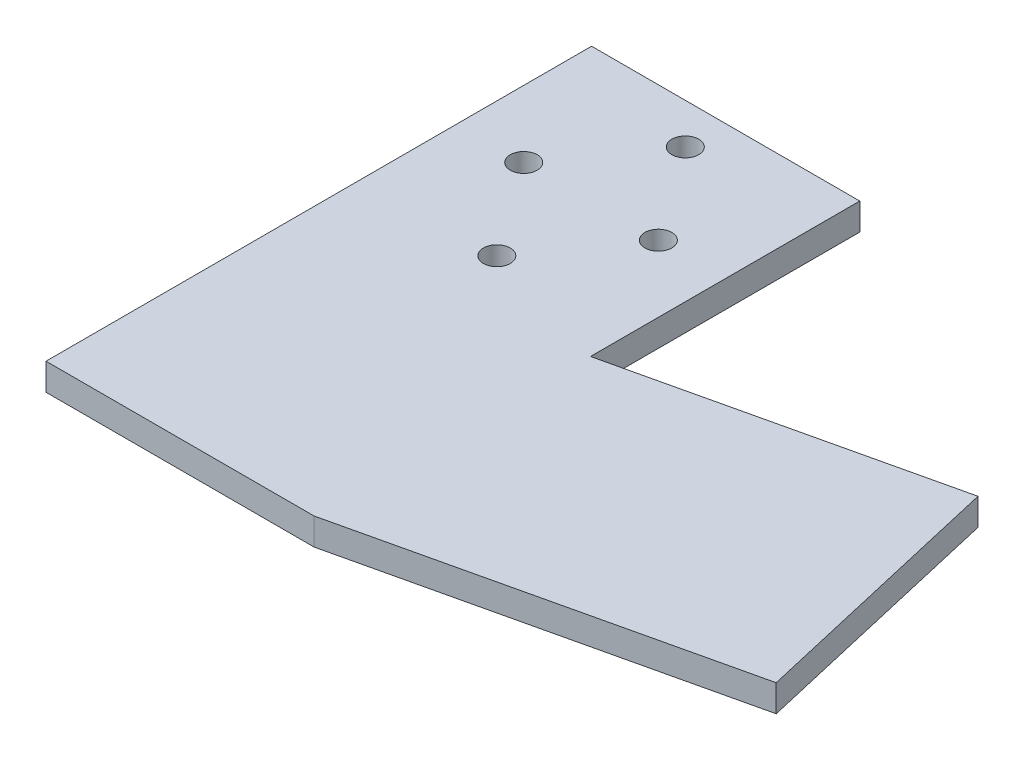
ISO-10303-21;
HEADER;
FILE_DESCRIPTION(('STEP AP214'),'2;1');
FILE_NAME('part.step','',(''),(''),'','','');
FILE_SCHEMA(('AUTOMOTIVE_DESIGN { 1 0 10303 214 1 1 1 1 }'));
ENDSEC;
DATA;
#1=APPLICATION_CONTEXT('core data for automotive mechanical design processes');
#2=APPLICATION_PROTOCOL_DEFINITION('international standard','automotive_design',2000,#1);
#3=PRODUCT_CONTEXT('',#1,'mechanical');
#4=PRODUCT('Part','Part','',(#3));
#5=PRODUCT_RELATED_PRODUCT_CATEGORY('part','',(#4));
#6=PRODUCT_DEFINITION_FORMATION('','',#4);
#7=PRODUCT_DEFINITION_CONTEXT('part definition',#1,'design');
#8=PRODUCT_DEFINITION('design','',#6,#7);
#9=PRODUCT_DEFINITION_SHAPE('','',#8);
#10=(LENGTH_UNIT() NAMED_UNIT(*) SI_UNIT(.MILLI.,.METRE.));
#11=(NAMED_UNIT(*) PLANE_ANGLE_UNIT() SI_UNIT($,.RADIAN.));
#12=(NAMED_UNIT(*) SI_UNIT($,.STERADIAN.) SOLID_ANGLE_UNIT());
#13=UNCERTAINTY_MEASURE_WITH_UNIT(LENGTH_MEASURE(1.E-05),#10,'distance_accuracy_value','');
#14=(GEOMETRIC_REPRESENTATION_CONTEXT(3) GLOBAL_UNCERTAINTY_ASSIGNED_CONTEXT((#13)) GLOBAL_UNIT_ASSIGNED_CONTEXT((#10,
#11,#12)) REPRESENTATION_CONTEXT('',''));
#15=CARTESIAN_POINT('',(0.,0.,0.));
#16=DIRECTION('',(0.,0.,1.));
#17=DIRECTION('',(1.,0.,0.));
#18=AXIS2_PLACEMENT_3D('',#15,#16,#17);
#19=CARTESIAN_POINT('',(0.,5.,0.));
#20=DIRECTION('',(-1.,0.,0.));
#21=DIRECTION('',(0.,0.,1.));
#22=AXIS2_PLACEMENT_3D('',#19,#20,#21);
#23=PLANE('',#22);
#24=DIRECTION('',(0.,0.,-1.));
#25=VECTOR('',#24,1.);
#26=CARTESIAN_POINT('',(0.,0.,0.));
#27=LINE('',#26,#25);
#28=CARTESIAN_POINT('',(0.,0.,0.));
#29=VERTEX_POINT('',#28);
#30=CARTESIAN_POINT('',(0.,0.,-50.));
#31=VERTEX_POINT('',#30);
#32=EDGE_CURVE('E133',#29,#31,#27,.T.);
#33=ORIENTED_EDGE('',*,*,#32,.T.);
#34=DIRECTION('',(0.,-1.,0.));
#35=VECTOR('',#34,1.);
#36=CARTESIAN_POINT('',(0.,5.,-50.));
#37=LINE('',#36,#35);
#38=CARTESIAN_POINT('',(0.,5.,-50.));
#39=VERTEX_POINT('',#38);
#40=EDGE_CURVE('E11',#39,#31,#37,.T.);
#41=ORIENTED_EDGE('',*,*,#40,.F.);
#42=DIRECTION('',(0.,0.,-1.));
#43=VECTOR('',#42,1.);
#44=CARTESIAN_POINT('',(0.,5.,0.));
#45=LINE('',#44,#43);
#46=CARTESIAN_POINT('',(0.,5.,0.));
#47=VERTEX_POINT('',#46);
#48=EDGE_CURVE('E154',#47,#39,#45,.T.);
#49=ORIENTED_EDGE('',*,*,#48,.F.);
#50=DIRECTION('',(0.,-1.,0.));
#51=VECTOR('',#50,1.);
#52=CARTESIAN_POINT('',(0.,5.,0.));
#53=LINE('',#52,#51);
#54=EDGE_CURVE('E129',#47,#29,#53,.T.);
#55=ORIENTED_EDGE('',*,*,#54,.T.);
#56=EDGE_LOOP('',(#33,#41,#49,#55));
#57=FACE_BOUND('',#56,.T.);
#58=ADVANCED_FACE('F38',(#57),#23,.F.);
#59=CARTESIAN_POINT('',(-49.8,5.,-50.));
#60=DIRECTION('',(0.,0.,1.));
#61=DIRECTION('',(1.,0.,0.));
#62=AXIS2_PLACEMENT_3D('',#59,#60,#61);
#63=PLANE('',#62);
#64=DIRECTION('',(-1.,0.,0.));
#65=VECTOR('',#64,1.);
#66=CARTESIAN_POINT('',(-49.8,0.,-50.));
#67=LINE('',#66,#65);
#68=CARTESIAN_POINT('',(-49.8,0.,-50.));
#69=VERTEX_POINT('',#68);
#70=EDGE_CURVE('E137',#31,#69,#67,.T.);
#71=ORIENTED_EDGE('',*,*,#70,.T.);
#72=DIRECTION('',(0.,-1.,0.));
#73=VECTOR('',#72,1.);
#74=CARTESIAN_POINT('',(-49.8,5.,-50.));
#75=LINE('',#74,#73);
#76=CARTESIAN_POINT('',(-49.8,5.,-50.));
#77=VERTEX_POINT('',#76);
#78=EDGE_CURVE('E47',#77,#69,#75,.T.);
#79=ORIENTED_EDGE('',*,*,#78,.F.);
#80=DIRECTION('',(-1.,0.,0.));
#81=VECTOR('',#80,1.);
#82=CARTESIAN_POINT('',(-49.8,5.,-50.));
#83=LINE('',#82,#81);
#84=EDGE_CURVE('E95',#39,#77,#83,.T.);
#85=ORIENTED_EDGE('',*,*,#84,.F.);
#86=ORIENTED_EDGE('',*,*,#40,.T.);
#87=EDGE_LOOP('',(#71,#79,#85,#86));
#88=FACE_BOUND('',#87,.T.);
#89=ADVANCED_FACE('F171',(#88),#63,.F.);
#90=CARTESIAN_POINT('',(-49.8,5.,0.));
#91=DIRECTION('',(1.,0.,0.));
#92=DIRECTION('',(0.,0.,-1.));
#93=AXIS2_PLACEMENT_3D('',#90,#91,#92);
#94=PLANE('',#93);
#95=DIRECTION('',(0.,0.,1.));
#96=VECTOR('',#95,1.);
#97=CARTESIAN_POINT('',(-49.8,0.,0.));
#98=LINE('',#97,#96);
#99=CARTESIAN_POINT('',(-49.8,0.,51.3152053896695));
#100=VERTEX_POINT('',#99);
#101=EDGE_CURVE('E142',#69,#100,#98,.T.);
#102=ORIENTED_EDGE('',*,*,#101,.T.);
#103=DIRECTION('',(0.,-1.,0.));
#104=VECTOR('',#103,1.);
#105=CARTESIAN_POINT('',(-49.8,5.,51.3152053896695));
#106=LINE('',#105,#104);
#107=CARTESIAN_POINT('',(-49.8,5.,51.3152053896695));
#108=VERTEX_POINT('',#107);
#109=EDGE_CURVE('E161',#108,#100,#106,.T.);
#110=ORIENTED_EDGE('',*,*,#109,.F.);
#111=DIRECTION('',(0.,0.,1.));
#112=VECTOR('',#111,1.);
#113=CARTESIAN_POINT('',(-49.8,5.,0.));
#114=LINE('',#113,#112);
#115=EDGE_CURVE('E170',#77,#108,#114,.T.);
#116=ORIENTED_EDGE('',*,*,#115,.F.);
#117=ORIENTED_EDGE('',*,*,#78,.T.);
#118=EDGE_LOOP('',(#102,#110,#116,#117));
#119=FACE_BOUND('',#118,.T.);
#120=ADVANCED_FACE('F168',(#119),#94,.F.);
#121=CARTESIAN_POINT('',(-49.8,5.,51.3152053896695));
#122=DIRECTION('',(0.,0.,-1.));
#123=DIRECTION('',(-1.,0.,0.));
#124=AXIS2_PLACEMENT_3D('',#121,#122,#123);
#125=PLANE('',#124);
#126=DIRECTION('',(1.,0.,0.));
#127=VECTOR('',#126,1.);
#128=CARTESIAN_POINT('',(-49.8,0.,51.3152053896695));
#129=LINE('',#128,#127);
#130=CARTESIAN_POINT('',(0.,0.,51.3152053896695));
#131=VERTEX_POINT('',#130);
#132=EDGE_CURVE('E145',#100,#131,#129,.T.);
#133=ORIENTED_EDGE('',*,*,#132,.T.);
#134=DIRECTION('',(0.,-1.,0.));
#135=VECTOR('',#134,1.);
#136=CARTESIAN_POINT('',(0.,5.,51.3152053896695));
#137=LINE('',#136,#135);
#138=CARTESIAN_POINT('',(0.,5.,51.3152053896695));
#139=VERTEX_POINT('',#138);
#140=EDGE_CURVE('E122',#139,#131,#137,.T.);
#141=ORIENTED_EDGE('',*,*,#140,.F.);
#142=DIRECTION('',(1.,0.,0.));
#143=VECTOR('',#142,1.);
#144=CARTESIAN_POINT('',(-49.8,5.,51.3152053896695));
#145=LINE('',#144,#143);
#146=EDGE_CURVE('E111',#108,#139,#145,.T.);
#147=ORIENTED_EDGE('',*,*,#146,.F.);
#148=ORIENTED_EDGE('',*,*,#109,.T.);
#149=EDGE_LOOP('',(#133,#141,#147,#148));
#150=FACE_BOUND('',#149,.T.);
#151=ADVANCED_FACE('F178',(#150),#125,.F.);
#152=CARTESIAN_POINT('',(69.7097566043073,5.,35.2214399786301));
#153=DIRECTION('',(-0.224951054343861,0.,-0.974370064785236));
#154=DIRECTION('',(-0.974370064785236,0.,0.224951054343861));
#155=AXIS2_PLACEMENT_3D('',#152,#153,#154);
#156=PLANE('',#155);
#157=DIRECTION('',(0.974370064785236,0.,-0.224951054343861));
#158=VECTOR('',#157,1.);
#159=CARTESIAN_POINT('',(69.7097566043073,0.,35.2214399786301));
#160=LINE('',#159,#158);
#161=CARTESIAN_POINT('',(69.7097566043073,0.,35.2214399786301));
#162=VERTEX_POINT('',#161);
#163=EDGE_CURVE('E120',#131,#162,#160,.T.);
#164=ORIENTED_EDGE('',*,*,#163,.T.);
#165=DIRECTION('',(0.,-1.,0.));
#166=VECTOR('',#165,1.);
#167=CARTESIAN_POINT('',(69.7097566043073,5.,35.2214399786301));
#168=LINE('',#167,#166);
#169=CARTESIAN_POINT('',(69.7097566043073,5.,35.2214399786301));
#170=VERTEX_POINT('',#169);
#171=EDGE_CURVE('E117',#170,#162,#168,.T.);
#172=ORIENTED_EDGE('',*,*,#171,.F.);
#173=DIRECTION('',(0.974370064785236,0.,-0.224951054343861));
#174=VECTOR('',#173,1.);
#175=CARTESIAN_POINT('',(69.7097566043073,5.,35.2214399786301));
#176=LINE('',#175,#174);
#177=EDGE_CURVE('E105',#139,#170,#176,.T.);
#178=ORIENTED_EDGE('',*,*,#177,.F.);
#179=ORIENTED_EDGE('',*,*,#140,.T.);
#180=EDGE_LOOP('',(#164,#172,#178,#179));
#181=FACE_BOUND('',#180,.T.);
#182=ADVANCED_FACE('F118',(#181),#156,.F.);
#183=CARTESIAN_POINT('',(58.4622038871142,5.,-13.4970632606317));
#184=DIRECTION('',(-0.974370064785236,0.,0.224951054343863));
#185=DIRECTION('',(0.224951054343863,0.,0.974370064785236));
#186=AXIS2_PLACEMENT_3D('',#183,#184,#185);
#187=PLANE('',#186);
#188=DIRECTION('',(-0.224951054343863,0.,-0.974370064785236));
#189=VECTOR('',#188,1.);
#190=CARTESIAN_POINT('',(58.4622038871142,0.,-13.4970632606317));
#191=LINE('',#190,#189);
#192=CARTESIAN_POINT('',(58.4622038871142,0.,-13.4970632606317));
#193=VERTEX_POINT('',#192);
#194=EDGE_CURVE('E81',#162,#193,#191,.T.);
#195=ORIENTED_EDGE('',*,*,#194,.T.);
#196=DIRECTION('',(0.,-1.,0.));
#197=VECTOR('',#196,1.);
#198=CARTESIAN_POINT('',(58.4622038871142,5.,-13.4970632606317));
#199=LINE('',#198,#197);
#200=CARTESIAN_POINT('',(58.4622038871142,5.,-13.4970632606317));
#201=VERTEX_POINT('',#200);
#202=EDGE_CURVE('E123',#201,#193,#199,.T.);
#203=ORIENTED_EDGE('',*,*,#202,.F.);
#204=DIRECTION('',(-0.224951054343863,0.,-0.974370064785236));
#205=VECTOR('',#204,1.);
#206=CARTESIAN_POINT('',(58.4622038871142,5.,-13.4970632606317));
#207=LINE('',#206,#205);
#208=EDGE_CURVE('E109',#170,#201,#207,.T.);
#209=ORIENTED_EDGE('',*,*,#208,.F.);
#210=ORIENTED_EDGE('',*,*,#171,.T.);
#211=EDGE_LOOP('',(#195,#203,#209,#210));
#212=FACE_BOUND('',#211,.T.);
#213=ADVANCED_FACE('F125',(#212),#187,.F.);
#214=CARTESIAN_POINT('',(0.,5.,0.));
#215=DIRECTION('',(0.224951054343862,0.,0.974370064785236));
#216=DIRECTION('',(0.974370064785236,0.,-0.224951054343862));
#217=AXIS2_PLACEMENT_3D('',#214,#215,#216);
#218=PLANE('',#217);
#219=DIRECTION('',(-0.974370064785236,0.,0.224951054343862));
#220=VECTOR('',#219,1.);
#221=CARTESIAN_POINT('',(0.,0.,0.));
#222=LINE('',#221,#220);
#223=EDGE_CURVE('E87',#193,#29,#222,.T.);
#224=ORIENTED_EDGE('',*,*,#223,.T.);
#225=ORIENTED_EDGE('',*,*,#54,.F.);
#226=DIRECTION('',(-0.974370064785236,0.,0.224951054343862));
#227=VECTOR('',#226,1.);
#228=CARTESIAN_POINT('',(0.,5.,0.));
#229=LINE('',#228,#227);
#230=EDGE_CURVE('E55',#201,#47,#229,.T.);
#231=ORIENTED_EDGE('',*,*,#230,.F.);
#232=ORIENTED_EDGE('',*,*,#202,.T.);
#233=EDGE_LOOP('',(#224,#225,#231,#232));
#234=FACE_BOUND('',#233,.T.);
#235=ADVANCED_FACE('F230',(#234),#218,.F.);
#236=CARTESIAN_POINT('',(0.,5.,0.));
#237=DIRECTION('',(0.,-1.,0.));
#238=DIRECTION('',(0.,0.,-1.));
#239=AXIS2_PLACEMENT_3D('',#236,#237,#238);
#240=PLANE('',#239);
#241=CARTESIAN_POINT('',(-24.9,5.,-42.5));
#242=DIRECTION('',(0.,-1.,0.));
#243=DIRECTION('',(0.,0.,-1.));
#244=AXIS2_PLACEMENT_3D('',#241,#242,#243);
#245=CIRCLE('',#244,2.5);
#246=CARTESIAN_POINT('',(-24.9,5.,-45.));
#247=VERTEX_POINT('',#246);
#248=EDGE_CURVE('E138',#247,#247,#245,.T.);
#249=ORIENTED_EDGE('',*,*,#248,.T.);
#250=EDGE_LOOP('',(#249));
#251=FACE_BOUND('',#250,.T.);
#252=CARTESIAN_POINT('',(-24.9,5.,-7.5));
#253=DIRECTION('',(0.,-1.,0.));
#254=DIRECTION('',(0.,0.,-1.));
#255=AXIS2_PLACEMENT_3D('',#252,#253,#254);
#256=CIRCLE('',#255,2.5);
#257=CARTESIAN_POINT('',(-24.9,5.,-10.));
#258=VERTEX_POINT('',#257);
#259=EDGE_CURVE('E190',#258,#258,#256,.T.);
#260=ORIENTED_EDGE('',*,*,#259,.T.);
#261=EDGE_LOOP('',(#260));
#262=FACE_BOUND('',#261,.T.);
#263=CARTESIAN_POINT('',(-12.4,5.,-25.));
#264=DIRECTION('',(0.,-1.,0.));
#265=DIRECTION('',(0.,0.,-1.));
#266=AXIS2_PLACEMENT_3D('',#263,#264,#265);
#267=CIRCLE('',#266,2.5);
#268=CARTESIAN_POINT('',(-12.4,5.,-27.5));
#269=VERTEX_POINT('',#268);
#270=EDGE_CURVE('E194',#269,#269,#267,.T.);
#271=ORIENTED_EDGE('',*,*,#270,.T.);
#272=EDGE_LOOP('',(#271));
#273=FACE_BOUND('',#272,.T.);
#274=CARTESIAN_POINT('',(-37.4,5.,-25.));
#275=DIRECTION('',(0.,-1.,0.));
#276=DIRECTION('',(0.,0.,-1.));
#277=AXIS2_PLACEMENT_3D('',#274,#275,#276);
#278=CIRCLE('',#277,2.5);
#279=CARTESIAN_POINT('',(-37.4,5.,-27.5));
#280=VERTEX_POINT('',#279);
#281=EDGE_CURVE('E198',#280,#280,#278,.T.);
#282=ORIENTED_EDGE('',*,*,#281,.T.);
#283=EDGE_LOOP('',(#282));
#284=FACE_BOUND('',#283,.T.);
#285=ORIENTED_EDGE('',*,*,#48,.T.);
#286=ORIENTED_EDGE('',*,*,#84,.T.);
#287=ORIENTED_EDGE('',*,*,#115,.T.);
#288=ORIENTED_EDGE('',*,*,#146,.T.);
#289=ORIENTED_EDGE('',*,*,#177,.T.);
#290=ORIENTED_EDGE('',*,*,#208,.T.);
#291=ORIENTED_EDGE('',*,*,#230,.T.);
#292=EDGE_LOOP('',(#285,#286,#287,#288,#289,#290,#291));
#293=FACE_BOUND('',#292,.T.);
#294=ADVANCED_FACE('F107',(#251,#262,#273,#284,#293),#240,.F.);
#295=CARTESIAN_POINT('',(0.,0.,0.));
#296=DIRECTION('',(0.,-1.,0.));
#297=DIRECTION('',(0.,0.,-1.));
#298=AXIS2_PLACEMENT_3D('',#295,#296,#297);
#299=PLANE('',#298);
#300=CARTESIAN_POINT('',(-24.9,0.,-42.5));
#301=DIRECTION('',(0.,1.,0.));
#302=DIRECTION('',(0.,0.,1.));
#303=AXIS2_PLACEMENT_3D('',#300,#301,#302);
#304=CIRCLE('',#303,2.5);
#305=CARTESIAN_POINT('',(-24.9,0.,-40.));
#306=VERTEX_POINT('',#305);
#307=EDGE_CURVE('E202',#306,#306,#304,.T.);
#308=ORIENTED_EDGE('',*,*,#307,.T.);
#309=EDGE_LOOP('',(#308));
#310=FACE_BOUND('',#309,.T.);
#311=CARTESIAN_POINT('',(-24.9,0.,-7.5));
#312=DIRECTION('',(0.,1.,0.));
#313=DIRECTION('',(0.,0.,-1.));
#314=AXIS2_PLACEMENT_3D('',#311,#312,#313);
#315=CIRCLE('',#314,2.5);
#316=CARTESIAN_POINT('',(-24.9,0.,-10.));
#317=VERTEX_POINT('',#316);
#318=EDGE_CURVE('E211',#317,#317,#315,.T.);
#319=ORIENTED_EDGE('',*,*,#318,.T.);
#320=EDGE_LOOP('',(#319));
#321=FACE_BOUND('',#320,.T.);
#322=CARTESIAN_POINT('',(-12.4,0.,-25.));
#323=DIRECTION('',(0.,1.,0.));
#324=DIRECTION('',(0.,0.,1.));
#325=AXIS2_PLACEMENT_3D('',#322,#323,#324);
#326=CIRCLE('',#325,2.5);
#327=CARTESIAN_POINT('',(-12.4,0.,-22.5));
#328=VERTEX_POINT('',#327);
#329=EDGE_CURVE('E207',#328,#328,#326,.T.);
#330=ORIENTED_EDGE('',*,*,#329,.T.);
#331=EDGE_LOOP('',(#330));
#332=FACE_BOUND('',#331,.T.);
#333=CARTESIAN_POINT('',(-37.4,0.,-25.));
#334=DIRECTION('',(0.,1.,0.));
#335=DIRECTION('',(0.,0.,-1.));
#336=AXIS2_PLACEMENT_3D('',#333,#334,#335);
#337=CIRCLE('',#336,2.5);
#338=CARTESIAN_POINT('',(-37.4,0.,-27.5));
#339=VERTEX_POINT('',#338);
#340=EDGE_CURVE('E203',#339,#339,#337,.T.);
#341=ORIENTED_EDGE('',*,*,#340,.T.);
#342=EDGE_LOOP('',(#341));
#343=FACE_BOUND('',#342,.T.);
#344=ORIENTED_EDGE('',*,*,#32,.F.);
#345=ORIENTED_EDGE('',*,*,#223,.F.);
#346=ORIENTED_EDGE('',*,*,#194,.F.);
#347=ORIENTED_EDGE('',*,*,#163,.F.);
#348=ORIENTED_EDGE('',*,*,#132,.F.);
#349=ORIENTED_EDGE('',*,*,#101,.F.);
#350=ORIENTED_EDGE('',*,*,#70,.F.);
#351=EDGE_LOOP('',(#344,#345,#346,#347,#348,#349,#350));
#352=FACE_BOUND('',#351,.T.);
#353=ADVANCED_FACE('F175',(#310,#321,#332,#343,#352),#299,.T.);
#354=CARTESIAN_POINT('',(-37.4,0.,-25.));
#355=DIRECTION('',(0.,1.,0.));
#356=DIRECTION('',(0.,0.,1.));
#357=AXIS2_PLACEMENT_3D('',#354,#355,#356);
#358=CYLINDRICAL_SURFACE('',#357,2.5);
#359=ORIENTED_EDGE('',*,*,#340,.F.);
#360=EDGE_LOOP('',(#359));
#361=FACE_BOUND('',#360,.T.);
#362=ORIENTED_EDGE('',*,*,#281,.F.);
#363=EDGE_LOOP('',(#362));
#364=FACE_BOUND('',#363,.T.);
#365=ADVANCED_FACE('F238',(#361,#364),#358,.F.);
#366=CARTESIAN_POINT('',(-12.4,0.,-25.));
#367=DIRECTION('',(0.,1.,0.));
#368=DIRECTION('',(0.,0.,1.));
#369=AXIS2_PLACEMENT_3D('',#366,#367,#368);
#370=CYLINDRICAL_SURFACE('',#369,2.5);
#371=ORIENTED_EDGE('',*,*,#329,.F.);
#372=EDGE_LOOP('',(#371));
#373=FACE_BOUND('',#372,.T.);
#374=ORIENTED_EDGE('',*,*,#270,.F.);
#375=EDGE_LOOP('',(#374));
#376=FACE_BOUND('',#375,.T.);
#377=ADVANCED_FACE('F240',(#373,#376),#370,.F.);
#378=CARTESIAN_POINT('',(-24.9,0.,-7.5));
#379=DIRECTION('',(0.,1.,0.));
#380=DIRECTION('',(0.,0.,1.));
#381=AXIS2_PLACEMENT_3D('',#378,#379,#380);
#382=CYLINDRICAL_SURFACE('',#381,2.5);
#383=ORIENTED_EDGE('',*,*,#318,.F.);
#384=EDGE_LOOP('',(#383));
#385=FACE_BOUND('',#384,.T.);
#386=ORIENTED_EDGE('',*,*,#259,.F.);
#387=EDGE_LOOP('',(#386));
#388=FACE_BOUND('',#387,.T.);
#389=ADVANCED_FACE('F224',(#385,#388),#382,.F.);
#390=CARTESIAN_POINT('',(-24.9,0.,-42.5));
#391=DIRECTION('',(0.,1.,0.));
#392=DIRECTION('',(0.,0.,1.));
#393=AXIS2_PLACEMENT_3D('',#390,#391,#392);
#394=CYLINDRICAL_SURFACE('',#393,2.5);
#395=ORIENTED_EDGE('',*,*,#307,.F.);
#396=EDGE_LOOP('',(#395));
#397=FACE_BOUND('',#396,.T.);
#398=ORIENTED_EDGE('',*,*,#248,.F.);
#399=EDGE_LOOP('',(#398));
#400=FACE_BOUND('',#399,.T.);
#401=ADVANCED_FACE('F221',(#397,#400),#394,.F.);
#402=CLOSED_SHELL('',(#58,#89,#120,#151,#182,#213,#235,#294,#353,#365,#377,#389,#401));
#403=MANIFOLD_SOLID_BREP('B2',#402);
#404=ADVANCED_BREP_SHAPE_REPRESENTATION('',(#18,#403),#14);
#405=SHAPE_DEFINITION_REPRESENTATION(#9,#404);
ENDSEC;
END-ISO-10303-21;
